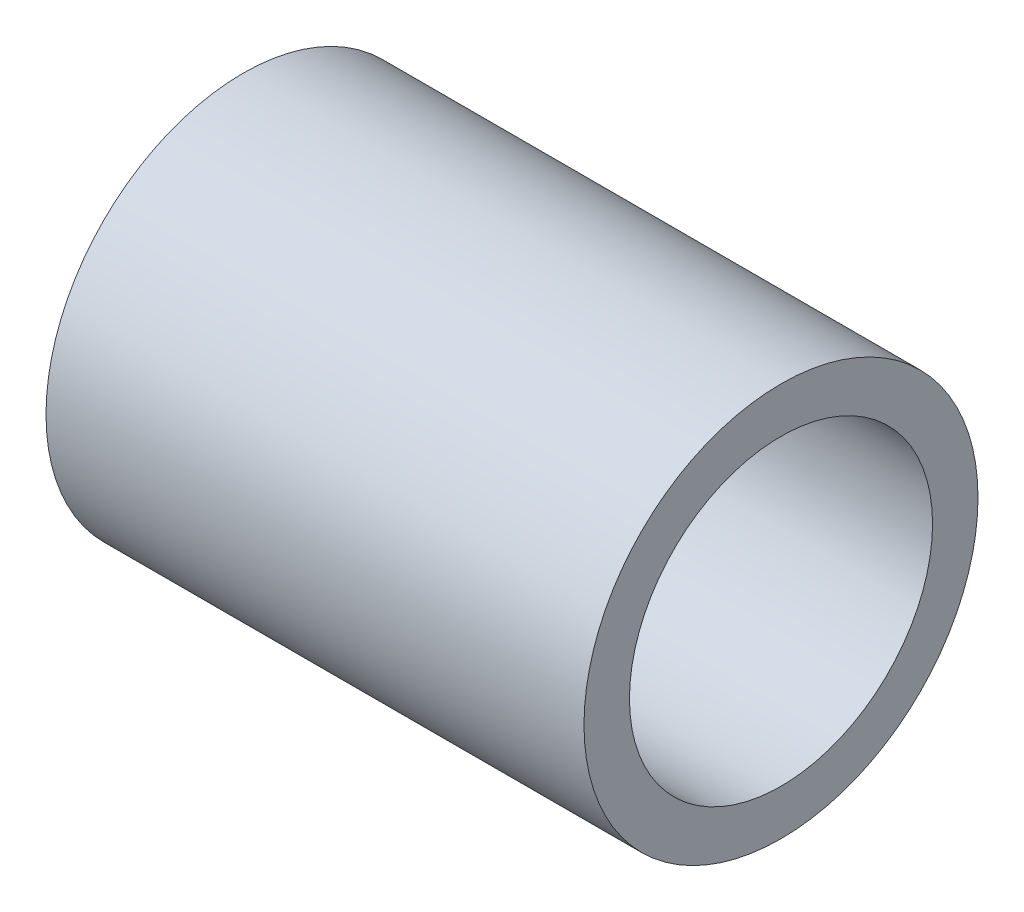
ISO-10303-21;
HEADER;
FILE_DESCRIPTION(('STEP AP214'),'2;1');
FILE_NAME('part.step','',(''),(''),'','','');
FILE_SCHEMA(('AUTOMOTIVE_DESIGN { 1 0 10303 214 1 1 1 1 }'));
ENDSEC;
DATA;
#1=APPLICATION_CONTEXT('core data for automotive mechanical design processes');
#2=APPLICATION_PROTOCOL_DEFINITION('international standard','automotive_design',2000,#1);
#3=PRODUCT_CONTEXT('',#1,'mechanical');
#4=PRODUCT('Part','Part','',(#3));
#5=PRODUCT_RELATED_PRODUCT_CATEGORY('part','',(#4));
#6=PRODUCT_DEFINITION_FORMATION('','',#4);
#7=PRODUCT_DEFINITION_CONTEXT('part definition',#1,'design');
#8=PRODUCT_DEFINITION('design','',#6,#7);
#9=PRODUCT_DEFINITION_SHAPE('','',#8);
#10=(LENGTH_UNIT() NAMED_UNIT(*) SI_UNIT(.MILLI.,.METRE.));
#11=(NAMED_UNIT(*) PLANE_ANGLE_UNIT() SI_UNIT($,.RADIAN.));
#12=(NAMED_UNIT(*) SI_UNIT($,.STERADIAN.) SOLID_ANGLE_UNIT());
#13=UNCERTAINTY_MEASURE_WITH_UNIT(LENGTH_MEASURE(1.E-05),#10,'distance_accuracy_value','');
#14=(GEOMETRIC_REPRESENTATION_CONTEXT(3) GLOBAL_UNCERTAINTY_ASSIGNED_CONTEXT((#13)) GLOBAL_UNIT_ASSIGNED_CONTEXT((#10,
#11,#12)) REPRESENTATION_CONTEXT('',''));
#15=CARTESIAN_POINT('',(0.,0.,0.));
#16=DIRECTION('',(0.,0.,1.));
#17=DIRECTION('',(1.,0.,0.));
#18=AXIS2_PLACEMENT_3D('',#15,#16,#17);
#19=CARTESIAN_POINT('',(17.75,10.,0.));
#20=DIRECTION('',(-1.,0.,0.));
#21=DIRECTION('',(0.,0.,1.));
#22=AXIS2_PLACEMENT_3D('',#19,#20,#21);
#23=PLANE('',#22);
#24=CARTESIAN_POINT('',(17.75,0.,0.));
#25=DIRECTION('',(-1.,0.,0.));
#26=DIRECTION('',(0.,0.,1.));
#27=AXIS2_PLACEMENT_3D('',#24,#25,#26);
#28=CIRCLE('',#27,13.);
#29=CARTESIAN_POINT('',(17.75,0.,13.));
#30=VERTEX_POINT('',#29);
#31=EDGE_CURVE('E53',#30,#30,#28,.T.);
#32=ORIENTED_EDGE('',*,*,#31,.F.);
#33=EDGE_LOOP('',(#32));
#34=FACE_BOUND('',#33,.T.);
#35=CARTESIAN_POINT('',(17.75,0.,0.));
#36=DIRECTION('',(-1.,0.,0.));
#37=DIRECTION('',(0.,0.,1.));
#38=AXIS2_PLACEMENT_3D('',#35,#36,#37);
#39=CIRCLE('',#38,10.);
#40=CARTESIAN_POINT('',(17.75,0.,10.));
#41=VERTEX_POINT('',#40);
#42=EDGE_CURVE('E10',#41,#41,#39,.T.);
#43=ORIENTED_EDGE('',*,*,#42,.T.);
#44=EDGE_LOOP('',(#43));
#45=FACE_BOUND('',#44,.T.);
#46=ADVANCED_FACE('F39',(#34,#45),#23,.F.);
#47=CARTESIAN_POINT('',(0.,0.,0.));
#48=DIRECTION('',(-1.,0.,0.));
#49=DIRECTION('',(0.,0.,1.));
#50=AXIS2_PLACEMENT_3D('',#47,#48,#49);
#51=CYLINDRICAL_SURFACE('',#50,10.);
#52=ORIENTED_EDGE('',*,*,#42,.F.);
#53=EDGE_LOOP('',(#52));
#54=FACE_BOUND('',#53,.T.);
#55=CARTESIAN_POINT('',(-17.75,0.,0.));
#56=DIRECTION('',(-1.,0.,0.));
#57=DIRECTION('',(0.,0.,1.));
#58=AXIS2_PLACEMENT_3D('',#55,#56,#57);
#59=CIRCLE('',#58,10.);
#60=CARTESIAN_POINT('',(-17.75,0.,10.));
#61=VERTEX_POINT('',#60);
#62=EDGE_CURVE('E45',#61,#61,#59,.T.);
#63=ORIENTED_EDGE('',*,*,#62,.T.);
#64=EDGE_LOOP('',(#63));
#65=FACE_BOUND('',#64,.T.);
#66=ADVANCED_FACE('F62',(#54,#65),#51,.F.);
#67=CARTESIAN_POINT('',(-17.75,13.,0.));
#68=DIRECTION('',(1.,0.,0.));
#69=DIRECTION('',(0.,0.,-1.));
#70=AXIS2_PLACEMENT_3D('',#67,#68,#69);
#71=PLANE('',#70);
#72=ORIENTED_EDGE('',*,*,#62,.F.);
#73=EDGE_LOOP('',(#72));
#74=FACE_BOUND('',#73,.T.);
#75=CARTESIAN_POINT('',(-17.75,0.,0.));
#76=DIRECTION('',(-1.,0.,0.));
#77=DIRECTION('',(0.,0.,1.));
#78=AXIS2_PLACEMENT_3D('',#75,#76,#77);
#79=CIRCLE('',#78,13.);
#80=CARTESIAN_POINT('',(-17.75,0.,13.));
#81=VERTEX_POINT('',#80);
#82=EDGE_CURVE('E49',#81,#81,#79,.T.);
#83=ORIENTED_EDGE('',*,*,#82,.T.);
#84=EDGE_LOOP('',(#83));
#85=FACE_BOUND('',#84,.T.);
#86=ADVANCED_FACE('F66',(#74,#85),#71,.F.);
#87=CARTESIAN_POINT('',(0.,0.,0.));
#88=DIRECTION('',(-1.,0.,0.));
#89=DIRECTION('',(0.,0.,1.));
#90=AXIS2_PLACEMENT_3D('',#87,#88,#89);
#91=CYLINDRICAL_SURFACE('',#90,13.);
#92=ORIENTED_EDGE('',*,*,#82,.F.);
#93=EDGE_LOOP('',(#92));
#94=FACE_BOUND('',#93,.T.);
#95=ORIENTED_EDGE('',*,*,#31,.T.);
#96=EDGE_LOOP('',(#95));
#97=FACE_BOUND('',#96,.T.);
#98=ADVANCED_FACE('F59',(#94,#97),#91,.T.);
#99=CLOSED_SHELL('',(#46,#66,#86,#98));
#100=MANIFOLD_SOLID_BREP('B2',#99);
#101=ADVANCED_BREP_SHAPE_REPRESENTATION('',(#18,#100),#14);
#102=SHAPE_DEFINITION_REPRESENTATION(#9,#101);
ENDSEC;
END-ISO-10303-21;
